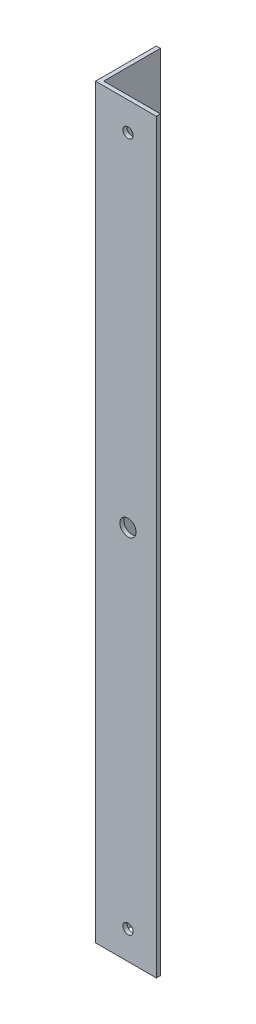
ISO-10303-21;
HEADER;
FILE_DESCRIPTION(('STEP AP214'),'2;1');
FILE_NAME('part.step','',(''),(''),'','','');
FILE_SCHEMA(('AUTOMOTIVE_DESIGN { 1 0 10303 214 1 1 1 1 }'));
ENDSEC;
DATA;
#1=APPLICATION_CONTEXT('core data for automotive mechanical design processes');
#2=APPLICATION_PROTOCOL_DEFINITION('international standard','automotive_design',2000,#1);
#3=PRODUCT_CONTEXT('',#1,'mechanical');
#4=PRODUCT('Part','Part','',(#3));
#5=PRODUCT_RELATED_PRODUCT_CATEGORY('part','',(#4));
#6=PRODUCT_DEFINITION_FORMATION('','',#4);
#7=PRODUCT_DEFINITION_CONTEXT('part definition',#1,'design');
#8=PRODUCT_DEFINITION('design','',#6,#7);
#9=PRODUCT_DEFINITION_SHAPE('','',#8);
#10=(LENGTH_UNIT() NAMED_UNIT(*) SI_UNIT(.MILLI.,.METRE.));
#11=(NAMED_UNIT(*) PLANE_ANGLE_UNIT() SI_UNIT($,.RADIAN.));
#12=(NAMED_UNIT(*) SI_UNIT($,.STERADIAN.) SOLID_ANGLE_UNIT());
#13=UNCERTAINTY_MEASURE_WITH_UNIT(LENGTH_MEASURE(1.E-05),#10,'distance_accuracy_value','');
#14=(GEOMETRIC_REPRESENTATION_CONTEXT(3) GLOBAL_UNCERTAINTY_ASSIGNED_CONTEXT((#13)) GLOBAL_UNIT_ASSIGNED_CONTEXT((#10,
#11,#12)) REPRESENTATION_CONTEXT('',''));
#15=CARTESIAN_POINT('',(0.,0.,0.));
#16=DIRECTION('',(0.,0.,1.));
#17=DIRECTION('',(1.,0.,0.));
#18=AXIS2_PLACEMENT_3D('',#15,#16,#17);
#19=CARTESIAN_POINT('',(0.,184.,0.));
#20=DIRECTION('',(0.,0.,1.));
#21=DIRECTION('',(1.,0.,0.));
#22=AXIS2_PLACEMENT_3D('',#19,#20,#21);
#23=PLANE('',#22);
#24=CARTESIAN_POINT('',(8.,92.6801604559913,0.));
#25=DIRECTION('',(0.,0.,1.));
#26=DIRECTION('',(1.,0.,0.));
#27=AXIS2_PLACEMENT_3D('',#24,#25,#26);
#28=CIRCLE('',#27,2.);
#29=CARTESIAN_POINT('',(10.,92.6801604559913,0.));
#30=VERTEX_POINT('',#29);
#31=EDGE_CURVE('E190',#30,#30,#28,.T.);
#32=ORIENTED_EDGE('',*,*,#31,.T.);
#33=EDGE_LOOP('',(#32));
#34=FACE_BOUND('',#33,.T.);
#35=CARTESIAN_POINT('',(8.,7.,0.));
#36=DIRECTION('',(0.,0.,1.));
#37=DIRECTION('',(1.,0.,0.));
#38=AXIS2_PLACEMENT_3D('',#35,#36,#37);
#39=CIRCLE('',#38,1.24999999999999);
#40=CARTESIAN_POINT('',(9.24999999999998,7.,0.));
#41=VERTEX_POINT('',#40);
#42=EDGE_CURVE('E184',#41,#41,#39,.T.);
#43=ORIENTED_EDGE('',*,*,#42,.T.);
#44=EDGE_LOOP('',(#43));
#45=FACE_BOUND('',#44,.T.);
#46=CARTESIAN_POINT('',(8.,177.,0.));
#47=DIRECTION('',(0.,0.,1.));
#48=DIRECTION('',(1.,0.,0.));
#49=AXIS2_PLACEMENT_3D('',#46,#47,#48);
#50=CIRCLE('',#49,1.24999999999999);
#51=CARTESIAN_POINT('',(9.24999999999998,177.,0.));
#52=VERTEX_POINT('',#51);
#53=EDGE_CURVE('E118',#52,#52,#50,.T.);
#54=ORIENTED_EDGE('',*,*,#53,.T.);
#55=EDGE_LOOP('',(#54));
#56=FACE_BOUND('',#55,.T.);
#57=DIRECTION('',(0.,-1.,0.));
#58=VECTOR('',#57,1.);
#59=CARTESIAN_POINT('',(1.,184.,0.));
#60=LINE('',#59,#58);
#61=CARTESIAN_POINT('',(0.999999999999988,184.,0.));
#62=VERTEX_POINT('',#61);
#63=CARTESIAN_POINT('',(0.999999999999977,0.,0.));
#64=VERTEX_POINT('',#63);
#65=EDGE_CURVE('E49',#62,#64,#60,.T.);
#66=ORIENTED_EDGE('',*,*,#65,.F.);
#67=DIRECTION('',(-1.,0.,0.));
#68=VECTOR('',#67,1.);
#69=CARTESIAN_POINT('',(0.,184.,0.));
#70=LINE('',#69,#68);
#71=CARTESIAN_POINT('',(15.,184.,0.));
#72=VERTEX_POINT('',#71);
#73=EDGE_CURVE('E132',#72,#62,#70,.T.);
#74=ORIENTED_EDGE('',*,*,#73,.F.);
#75=DIRECTION('',(0.,-1.,0.));
#76=VECTOR('',#75,1.);
#77=CARTESIAN_POINT('',(15.,184.,0.));
#78=LINE('',#77,#76);
#79=CARTESIAN_POINT('',(15.,0.,0.));
#80=VERTEX_POINT('',#79);
#81=EDGE_CURVE('E134',#72,#80,#78,.T.);
#82=ORIENTED_EDGE('',*,*,#81,.T.);
#83=DIRECTION('',(-1.,0.,0.));
#84=VECTOR('',#83,1.);
#85=CARTESIAN_POINT('',(0.,0.,0.));
#86=LINE('',#85,#84);
#87=EDGE_CURVE('E102',#80,#64,#86,.T.);
#88=ORIENTED_EDGE('',*,*,#87,.T.);
#89=EDGE_LOOP('',(#66,#74,#82,#88));
#90=FACE_BOUND('',#89,.T.);
#91=ADVANCED_FACE('F34',(#34,#45,#56,#90),#23,.F.);
#92=CARTESIAN_POINT('',(0.,184.,0.));
#93=DIRECTION('',(1.,0.,0.));
#94=DIRECTION('',(0.,0.,-1.));
#95=AXIS2_PLACEMENT_3D('',#92,#93,#94);
#96=PLANE('',#95);
#97=DIRECTION('',(0.,0.,1.));
#98=VECTOR('',#97,1.);
#99=CARTESIAN_POINT('',(0.,0.,0.));
#100=LINE('',#99,#98);
#101=CARTESIAN_POINT('',(0.,0.,-14.));
#102=VERTEX_POINT('',#101);
#103=CARTESIAN_POINT('',(0.,0.,1.));
#104=VERTEX_POINT('',#103);
#105=EDGE_CURVE('E128',#102,#104,#100,.T.);
#106=ORIENTED_EDGE('',*,*,#105,.T.);
#107=DIRECTION('',(0.,-1.,0.));
#108=VECTOR('',#107,1.);
#109=CARTESIAN_POINT('',(0.,184.,1.));
#110=LINE('',#109,#108);
#111=CARTESIAN_POINT('',(0.,184.,1.));
#112=VERTEX_POINT('',#111);
#113=EDGE_CURVE('E11',#112,#104,#110,.T.);
#114=ORIENTED_EDGE('',*,*,#113,.F.);
#115=DIRECTION('',(0.,0.,1.));
#116=VECTOR('',#115,1.);
#117=CARTESIAN_POINT('',(0.,184.,0.));
#118=LINE('',#117,#116);
#119=CARTESIAN_POINT('',(0.,184.,-14.));
#120=VERTEX_POINT('',#119);
#121=EDGE_CURVE('E97',#120,#112,#118,.T.);
#122=ORIENTED_EDGE('',*,*,#121,.F.);
#123=DIRECTION('',(0.,1.,0.));
#124=VECTOR('',#123,1.);
#125=CARTESIAN_POINT('',(0.,184.,-14.));
#126=LINE('',#125,#124);
#127=EDGE_CURVE('E101',#102,#120,#126,.T.);
#128=ORIENTED_EDGE('',*,*,#127,.F.);
#129=EDGE_LOOP('',(#106,#114,#122,#128));
#130=FACE_BOUND('',#129,.T.);
#131=ADVANCED_FACE('F36',(#130),#96,.F.);
#132=CARTESIAN_POINT('',(0.,184.,1.));
#133=DIRECTION('',(0.,0.,-1.));
#134=DIRECTION('',(-1.,0.,0.));
#135=AXIS2_PLACEMENT_3D('',#132,#133,#134);
#136=PLANE('',#135);
#137=CARTESIAN_POINT('',(8.,92.6801604559913,1.));
#138=DIRECTION('',(0.,0.,1.));
#139=DIRECTION('',(1.,0.,0.));
#140=AXIS2_PLACEMENT_3D('',#137,#138,#139);
#141=CIRCLE('',#140,2.);
#142=CARTESIAN_POINT('',(10.,92.6801604559913,1.));
#143=VERTEX_POINT('',#142);
#144=EDGE_CURVE('E175',#143,#143,#141,.T.);
#145=ORIENTED_EDGE('',*,*,#144,.F.);
#146=EDGE_LOOP('',(#145));
#147=FACE_BOUND('',#146,.T.);
#148=CARTESIAN_POINT('',(8.,7.,1.));
#149=DIRECTION('',(0.,0.,1.));
#150=DIRECTION('',(1.,0.,0.));
#151=AXIS2_PLACEMENT_3D('',#148,#149,#150);
#152=CIRCLE('',#151,1.24999999999999);
#153=CARTESIAN_POINT('',(9.24999999999998,7.,1.));
#154=VERTEX_POINT('',#153);
#155=EDGE_CURVE('E179',#154,#154,#152,.T.);
#156=ORIENTED_EDGE('',*,*,#155,.F.);
#157=EDGE_LOOP('',(#156));
#158=FACE_BOUND('',#157,.T.);
#159=CARTESIAN_POINT('',(8.,177.,1.));
#160=DIRECTION('',(0.,0.,1.));
#161=DIRECTION('',(1.,0.,0.));
#162=AXIS2_PLACEMENT_3D('',#159,#160,#161);
#163=CIRCLE('',#162,1.24999999999999);
#164=CARTESIAN_POINT('',(9.24999999999998,177.,1.));
#165=VERTEX_POINT('',#164);
#166=EDGE_CURVE('E182',#165,#165,#163,.T.);
#167=ORIENTED_EDGE('',*,*,#166,.F.);
#168=EDGE_LOOP('',(#167));
#169=FACE_BOUND('',#168,.T.);
#170=DIRECTION('',(1.,0.,0.));
#171=VECTOR('',#170,1.);
#172=CARTESIAN_POINT('',(0.,0.,1.));
#173=LINE('',#172,#171);
#174=CARTESIAN_POINT('',(15.,0.,1.));
#175=VERTEX_POINT('',#174);
#176=EDGE_CURVE('E136',#104,#175,#173,.T.);
#177=ORIENTED_EDGE('',*,*,#176,.T.);
#178=DIRECTION('',(0.,-1.,0.));
#179=VECTOR('',#178,1.);
#180=CARTESIAN_POINT('',(15.,184.,1.));
#181=LINE('',#180,#179);
#182=CARTESIAN_POINT('',(15.,184.,1.));
#183=VERTEX_POINT('',#182);
#184=EDGE_CURVE('E42',#183,#175,#181,.T.);
#185=ORIENTED_EDGE('',*,*,#184,.F.);
#186=DIRECTION('',(1.,0.,0.));
#187=VECTOR('',#186,1.);
#188=CARTESIAN_POINT('',(0.,184.,1.));
#189=LINE('',#188,#187);
#190=EDGE_CURVE('E79',#112,#183,#189,.T.);
#191=ORIENTED_EDGE('',*,*,#190,.F.);
#192=ORIENTED_EDGE('',*,*,#113,.T.);
#193=EDGE_LOOP('',(#177,#185,#191,#192));
#194=FACE_BOUND('',#193,.T.);
#195=ADVANCED_FACE('F163',(#147,#158,#169,#194),#136,.F.);
#196=CARTESIAN_POINT('',(15.,184.,0.));
#197=DIRECTION('',(-1.,0.,0.));
#198=DIRECTION('',(0.,0.,1.));
#199=AXIS2_PLACEMENT_3D('',#196,#197,#198);
#200=PLANE('',#199);
#201=DIRECTION('',(0.,0.,-1.));
#202=VECTOR('',#201,1.);
#203=CARTESIAN_POINT('',(15.,0.,0.));
#204=LINE('',#203,#202);
#205=EDGE_CURVE('E74',#175,#80,#204,.T.);
#206=ORIENTED_EDGE('',*,*,#205,.T.);
#207=ORIENTED_EDGE('',*,*,#81,.F.);
#208=DIRECTION('',(0.,0.,-1.));
#209=VECTOR('',#208,1.);
#210=CARTESIAN_POINT('',(15.,184.,0.));
#211=LINE('',#210,#209);
#212=EDGE_CURVE('E57',#183,#72,#211,.T.);
#213=ORIENTED_EDGE('',*,*,#212,.F.);
#214=ORIENTED_EDGE('',*,*,#184,.T.);
#215=EDGE_LOOP('',(#206,#207,#213,#214));
#216=FACE_BOUND('',#215,.T.);
#217=ADVANCED_FACE('F140',(#216),#200,.F.);
#218=CARTESIAN_POINT('',(0.,184.,0.));
#219=DIRECTION('',(0.,1.,0.));
#220=DIRECTION('',(0.,0.,1.));
#221=AXIS2_PLACEMENT_3D('',#218,#219,#220);
#222=PLANE('',#221);
#223=ORIENTED_EDGE('',*,*,#121,.T.);
#224=ORIENTED_EDGE('',*,*,#190,.T.);
#225=ORIENTED_EDGE('',*,*,#212,.T.);
#226=ORIENTED_EDGE('',*,*,#73,.T.);
#227=DIRECTION('',(0.,0.,1.));
#228=VECTOR('',#227,1.);
#229=CARTESIAN_POINT('',(1.,184.,-14.));
#230=LINE('',#229,#228);
#231=CARTESIAN_POINT('',(1.,184.,-14.));
#232=VERTEX_POINT('',#231);
#233=EDGE_CURVE('E108',#232,#62,#230,.T.);
#234=ORIENTED_EDGE('',*,*,#233,.F.);
#235=DIRECTION('',(1.,0.,0.));
#236=VECTOR('',#235,1.);
#237=CARTESIAN_POINT('',(0.,184.,-14.));
#238=LINE('',#237,#236);
#239=EDGE_CURVE('E105',#120,#232,#238,.T.);
#240=ORIENTED_EDGE('',*,*,#239,.F.);
#241=EDGE_LOOP('',(#223,#224,#225,#226,#234,#240));
#242=FACE_BOUND('',#241,.T.);
#243=ADVANCED_FACE('F106',(#242),#222,.T.);
#244=CARTESIAN_POINT('',(0.,0.,0.));
#245=DIRECTION('',(0.,1.,0.));
#246=DIRECTION('',(0.,0.,1.));
#247=AXIS2_PLACEMENT_3D('',#244,#245,#246);
#248=PLANE('',#247);
#249=ORIENTED_EDGE('',*,*,#105,.F.);
#250=DIRECTION('',(-1.,0.,0.));
#251=VECTOR('',#250,1.);
#252=CARTESIAN_POINT('',(0.,0.,-14.));
#253=LINE('',#252,#251);
#254=CARTESIAN_POINT('',(0.999999999999977,0.,-14.));
#255=VERTEX_POINT('',#254);
#256=EDGE_CURVE('E116',#255,#102,#253,.T.);
#257=ORIENTED_EDGE('',*,*,#256,.F.);
#258=DIRECTION('',(0.,0.,1.));
#259=VECTOR('',#258,1.);
#260=CARTESIAN_POINT('',(0.999999999999977,0.,-14.));
#261=LINE('',#260,#259);
#262=EDGE_CURVE('E124',#255,#64,#261,.T.);
#263=ORIENTED_EDGE('',*,*,#262,.T.);
#264=ORIENTED_EDGE('',*,*,#87,.F.);
#265=ORIENTED_EDGE('',*,*,#205,.F.);
#266=ORIENTED_EDGE('',*,*,#176,.F.);
#267=EDGE_LOOP('',(#249,#257,#263,#264,#265,#266));
#268=FACE_BOUND('',#267,.T.);
#269=ADVANCED_FACE('F143',(#268),#248,.F.);
#270=CARTESIAN_POINT('',(1.,184.,-14.));
#271=DIRECTION('',(-1.,0.,0.));
#272=DIRECTION('',(0.,-1.,0.));
#273=AXIS2_PLACEMENT_3D('',#270,#271,#272);
#274=PLANE('',#273);
#275=ORIENTED_EDGE('',*,*,#65,.T.);
#276=ORIENTED_EDGE('',*,*,#262,.F.);
#277=DIRECTION('',(0.,-1.,0.));
#278=VECTOR('',#277,1.);
#279=CARTESIAN_POINT('',(1.,184.,-14.));
#280=LINE('',#279,#278);
#281=EDGE_CURVE('E111',#232,#255,#280,.T.);
#282=ORIENTED_EDGE('',*,*,#281,.F.);
#283=ORIENTED_EDGE('',*,*,#233,.T.);
#284=EDGE_LOOP('',(#275,#276,#282,#283));
#285=FACE_BOUND('',#284,.T.);
#286=ADVANCED_FACE('F146',(#285),#274,.F.);
#287=CARTESIAN_POINT('',(0.,0.,-14.));
#288=DIRECTION('',(0.,0.,1.));
#289=DIRECTION('',(1.,0.,0.));
#290=AXIS2_PLACEMENT_3D('',#287,#288,#289);
#291=PLANE('',#290);
#292=ORIENTED_EDGE('',*,*,#127,.T.);
#293=ORIENTED_EDGE('',*,*,#239,.T.);
#294=ORIENTED_EDGE('',*,*,#281,.T.);
#295=ORIENTED_EDGE('',*,*,#256,.T.);
#296=EDGE_LOOP('',(#292,#293,#294,#295));
#297=FACE_BOUND('',#296,.T.);
#298=ADVANCED_FACE('F114',(#297),#291,.F.);
#299=CARTESIAN_POINT('',(8.,177.,1.));
#300=DIRECTION('',(0.,0.,1.));
#301=DIRECTION('',(1.,0.,0.));
#302=AXIS2_PLACEMENT_3D('',#299,#300,#301);
#303=CYLINDRICAL_SURFACE('',#302,1.24999999999999);
#304=ORIENTED_EDGE('',*,*,#166,.T.);
#305=EDGE_LOOP('',(#304));
#306=FACE_BOUND('',#305,.T.);
#307=ORIENTED_EDGE('',*,*,#53,.F.);
#308=EDGE_LOOP('',(#307));
#309=FACE_BOUND('',#308,.T.);
#310=ADVANCED_FACE('F153',(#306,#309),#303,.F.);
#311=CARTESIAN_POINT('',(8.,7.,1.));
#312=DIRECTION('',(0.,0.,1.));
#313=DIRECTION('',(1.,0.,0.));
#314=AXIS2_PLACEMENT_3D('',#311,#312,#313);
#315=CYLINDRICAL_SURFACE('',#314,1.24999999999999);
#316=ORIENTED_EDGE('',*,*,#155,.T.);
#317=EDGE_LOOP('',(#316));
#318=FACE_BOUND('',#317,.T.);
#319=ORIENTED_EDGE('',*,*,#42,.F.);
#320=EDGE_LOOP('',(#319));
#321=FACE_BOUND('',#320,.T.);
#322=ADVANCED_FACE('F196',(#318,#321),#315,.F.);
#323=CARTESIAN_POINT('',(8.,92.6801604559913,-9.));
#324=DIRECTION('',(0.,0.,1.));
#325=DIRECTION('',(1.,0.,0.));
#326=AXIS2_PLACEMENT_3D('',#323,#324,#325);
#327=CYLINDRICAL_SURFACE('',#326,2.);
#328=ORIENTED_EDGE('',*,*,#144,.T.);
#329=EDGE_LOOP('',(#328));
#330=FACE_BOUND('',#329,.T.);
#331=ORIENTED_EDGE('',*,*,#31,.F.);
#332=EDGE_LOOP('',(#331));
#333=FACE_BOUND('',#332,.T.);
#334=ADVANCED_FACE('F193',(#330,#333),#327,.F.);
#335=CLOSED_SHELL('',(#91,#131,#195,#217,#243,#269,#286,#298,#310,#322,#334));
#336=MANIFOLD_SOLID_BREP('B2',#335);
#337=ADVANCED_BREP_SHAPE_REPRESENTATION('',(#18,#336),#14);
#338=SHAPE_DEFINITION_REPRESENTATION(#9,#337);
ENDSEC;
END-ISO-10303-21;
